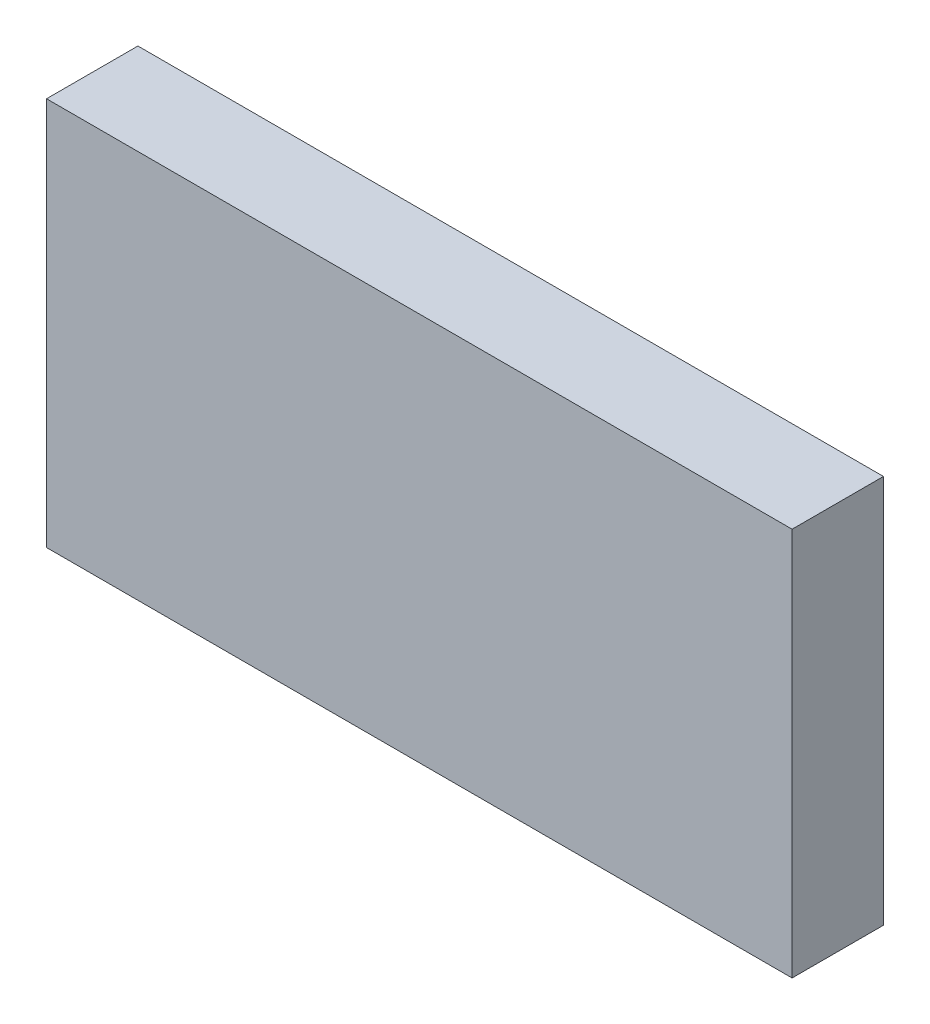
ISO-10303-21;
HEADER;
FILE_DESCRIPTION(('STEP AP214'),'2;1');
FILE_NAME('part.step','',(''),(''),'','','');
FILE_SCHEMA(('AUTOMOTIVE_DESIGN { 1 0 10303 214 1 1 1 1 }'));
ENDSEC;
DATA;
#1=APPLICATION_CONTEXT('core data for automotive mechanical design processes');
#2=APPLICATION_PROTOCOL_DEFINITION('international standard','automotive_design',2000,#1);
#3=PRODUCT_CONTEXT('',#1,'mechanical');
#4=PRODUCT('Part','Part','',(#3));
#5=PRODUCT_RELATED_PRODUCT_CATEGORY('part','',(#4));
#6=PRODUCT_DEFINITION_FORMATION('','',#4);
#7=PRODUCT_DEFINITION_CONTEXT('part definition',#1,'design');
#8=PRODUCT_DEFINITION('design','',#6,#7);
#9=PRODUCT_DEFINITION_SHAPE('','',#8);
#10=(LENGTH_UNIT() NAMED_UNIT(*) SI_UNIT(.MILLI.,.METRE.));
#11=(NAMED_UNIT(*) PLANE_ANGLE_UNIT() SI_UNIT($,.RADIAN.));
#12=(NAMED_UNIT(*) SI_UNIT($,.STERADIAN.) SOLID_ANGLE_UNIT());
#13=UNCERTAINTY_MEASURE_WITH_UNIT(LENGTH_MEASURE(1.E-05),#10,'distance_accuracy_value','');
#14=(GEOMETRIC_REPRESENTATION_CONTEXT(3) GLOBAL_UNCERTAINTY_ASSIGNED_CONTEXT((#13)) GLOBAL_UNIT_ASSIGNED_CONTEXT((#10,
#11,#12)) REPRESENTATION_CONTEXT('',''));
#15=CARTESIAN_POINT('',(0.,0.,0.));
#16=DIRECTION('',(0.,0.,1.));
#17=DIRECTION('',(1.,0.,0.));
#18=AXIS2_PLACEMENT_3D('',#15,#16,#17);
#19=CARTESIAN_POINT('',(0.,0.,0.5));
#20=DIRECTION('',(0.,0.,1.));
#21=DIRECTION('',(1.,0.,0.));
#22=AXIS2_PLACEMENT_3D('',#19,#20,#21);
#23=PLANE('',#22);
#24=DIRECTION('',(1.,0.,0.));
#25=VECTOR('',#24,1.);
#26=CARTESIAN_POINT('',(-2.04,-1.0635,0.5));
#27=LINE('',#26,#25);
#28=CARTESIAN_POINT('',(-2.04,-1.0635,0.5));
#29=VERTEX_POINT('',#28);
#30=CARTESIAN_POINT('',(2.04,-1.0635,0.5));
#31=VERTEX_POINT('',#30);
#32=EDGE_CURVE('E89',#29,#31,#27,.T.);
#33=ORIENTED_EDGE('',*,*,#32,.T.);
#34=DIRECTION('',(0.,1.,0.));
#35=VECTOR('',#34,1.);
#36=CARTESIAN_POINT('',(2.04,-1.0635,0.5));
#37=LINE('',#36,#35);
#38=CARTESIAN_POINT('',(2.04,1.0635,0.5));
#39=VERTEX_POINT('',#38);
#40=EDGE_CURVE('E76',#31,#39,#37,.T.);
#41=ORIENTED_EDGE('',*,*,#40,.T.);
#42=DIRECTION('',(-1.,0.,0.));
#43=VECTOR('',#42,1.);
#44=CARTESIAN_POINT('',(2.04,1.0635,0.5));
#45=LINE('',#44,#43);
#46=CARTESIAN_POINT('',(-2.04,1.0635,0.5));
#47=VERTEX_POINT('',#46);
#48=EDGE_CURVE('E81',#39,#47,#45,.T.);
#49=ORIENTED_EDGE('',*,*,#48,.T.);
#50=DIRECTION('',(0.,-1.,0.));
#51=VECTOR('',#50,1.);
#52=CARTESIAN_POINT('',(-2.04,1.0635,0.5));
#53=LINE('',#52,#51);
#54=EDGE_CURVE('E11',#47,#29,#53,.T.);
#55=ORIENTED_EDGE('',*,*,#54,.T.);
#56=EDGE_LOOP('',(#33,#41,#49,#55));
#57=FACE_BOUND('',#56,.T.);
#58=ADVANCED_FACE('F16',(#57),#23,.T.);
#59=CARTESIAN_POINT('',(0.,0.,0.));
#60=DIRECTION('',(0.,0.,1.));
#61=DIRECTION('',(1.,0.,0.));
#62=AXIS2_PLACEMENT_3D('',#59,#60,#61);
#63=PLANE('',#62);
#64=DIRECTION('',(1.,0.,0.));
#65=VECTOR('',#64,1.);
#66=CARTESIAN_POINT('',(-2.04,-1.0635,0.));
#67=LINE('',#66,#65);
#68=CARTESIAN_POINT('',(-2.04,-1.0635,0.));
#69=VERTEX_POINT('',#68);
#70=CARTESIAN_POINT('',(2.04,-1.0635,0.));
#71=VERTEX_POINT('',#70);
#72=EDGE_CURVE('E100',#69,#71,#67,.T.);
#73=ORIENTED_EDGE('',*,*,#72,.F.);
#74=DIRECTION('',(0.,-1.,0.));
#75=VECTOR('',#74,1.);
#76=CARTESIAN_POINT('',(-2.04,1.0635,0.));
#77=LINE('',#76,#75);
#78=CARTESIAN_POINT('',(-2.04,1.0635,0.));
#79=VERTEX_POINT('',#78);
#80=EDGE_CURVE('E26',#79,#69,#77,.T.);
#81=ORIENTED_EDGE('',*,*,#80,.F.);
#82=DIRECTION('',(-1.,0.,0.));
#83=VECTOR('',#82,1.);
#84=CARTESIAN_POINT('',(2.04,1.0635,0.));
#85=LINE('',#84,#83);
#86=CARTESIAN_POINT('',(2.04,1.0635,0.));
#87=VERTEX_POINT('',#86);
#88=EDGE_CURVE('E65',#87,#79,#85,.T.);
#89=ORIENTED_EDGE('',*,*,#88,.F.);
#90=DIRECTION('',(0.,1.,0.));
#91=VECTOR('',#90,1.);
#92=CARTESIAN_POINT('',(2.04,-1.0635,0.));
#93=LINE('',#92,#91);
#94=EDGE_CURVE('E70',#71,#87,#93,.T.);
#95=ORIENTED_EDGE('',*,*,#94,.F.);
#96=EDGE_LOOP('',(#73,#81,#89,#95));
#97=FACE_BOUND('',#96,.T.);
#98=ADVANCED_FACE('F68',(#97),#63,.F.);
#99=CARTESIAN_POINT('',(-2.04,1.0635,0.));
#100=DIRECTION('',(1.,0.,0.));
#101=DIRECTION('',(0.,1.,0.));
#102=AXIS2_PLACEMENT_3D('',#99,#100,#101);
#103=PLANE('',#102);
#104=DIRECTION('',(0.,0.,1.));
#105=VECTOR('',#104,1.);
#106=CARTESIAN_POINT('',(-2.04,1.0635,0.));
#107=LINE('',#106,#105);
#108=EDGE_CURVE('E75',#79,#47,#107,.T.);
#109=ORIENTED_EDGE('',*,*,#108,.F.);
#110=ORIENTED_EDGE('',*,*,#80,.T.);
#111=DIRECTION('',(0.,0.,1.));
#112=VECTOR('',#111,1.);
#113=CARTESIAN_POINT('',(-2.04,-1.0635,0.));
#114=LINE('',#113,#112);
#115=EDGE_CURVE('E97',#69,#29,#114,.T.);
#116=ORIENTED_EDGE('',*,*,#115,.T.);
#117=ORIENTED_EDGE('',*,*,#54,.F.);
#118=EDGE_LOOP('',(#109,#110,#116,#117));
#119=FACE_BOUND('',#118,.T.);
#120=ADVANCED_FACE('F120',(#119),#103,.F.);
#121=CARTESIAN_POINT('',(2.04,1.0635,0.));
#122=DIRECTION('',(0.,-1.,0.));
#123=DIRECTION('',(0.,0.,-1.));
#124=AXIS2_PLACEMENT_3D('',#121,#122,#123);
#125=PLANE('',#124);
#126=DIRECTION('',(0.,0.,1.));
#127=VECTOR('',#126,1.);
#128=CARTESIAN_POINT('',(2.04,1.0635,0.));
#129=LINE('',#128,#127);
#130=EDGE_CURVE('E79',#87,#39,#129,.T.);
#131=ORIENTED_EDGE('',*,*,#130,.F.);
#132=ORIENTED_EDGE('',*,*,#88,.T.);
#133=ORIENTED_EDGE('',*,*,#108,.T.);
#134=ORIENTED_EDGE('',*,*,#48,.F.);
#135=EDGE_LOOP('',(#131,#132,#133,#134));
#136=FACE_BOUND('',#135,.T.);
#137=ADVANCED_FACE('F80',(#136),#125,.F.);
#138=CARTESIAN_POINT('',(2.04,-1.0635,0.));
#139=DIRECTION('',(-1.,0.,0.));
#140=DIRECTION('',(0.,0.,1.));
#141=AXIS2_PLACEMENT_3D('',#138,#139,#140);
#142=PLANE('',#141);
#143=DIRECTION('',(0.,0.,1.));
#144=VECTOR('',#143,1.);
#145=CARTESIAN_POINT('',(2.04,-1.0635,0.));
#146=LINE('',#145,#144);
#147=EDGE_CURVE('E19',#71,#31,#146,.T.);
#148=ORIENTED_EDGE('',*,*,#147,.F.);
#149=ORIENTED_EDGE('',*,*,#94,.T.);
#150=ORIENTED_EDGE('',*,*,#130,.T.);
#151=ORIENTED_EDGE('',*,*,#40,.F.);
#152=EDGE_LOOP('',(#148,#149,#150,#151));
#153=FACE_BOUND('',#152,.T.);
#154=ADVANCED_FACE('F85',(#153),#142,.F.);
#155=CARTESIAN_POINT('',(-2.04,-1.0635,0.));
#156=DIRECTION('',(0.,1.,0.));
#157=DIRECTION('',(1.,0.,0.));
#158=AXIS2_PLACEMENT_3D('',#155,#156,#157);
#159=PLANE('',#158);
#160=ORIENTED_EDGE('',*,*,#115,.F.);
#161=ORIENTED_EDGE('',*,*,#72,.T.);
#162=ORIENTED_EDGE('',*,*,#147,.T.);
#163=ORIENTED_EDGE('',*,*,#32,.F.);
#164=EDGE_LOOP('',(#160,#161,#162,#163));
#165=FACE_BOUND('',#164,.T.);
#166=ADVANCED_FACE('F107',(#165),#159,.F.);
#167=CLOSED_SHELL('',(#58,#98,#120,#137,#154,#166));
#168=MANIFOLD_SOLID_BREP('B1',#167);
#169=ADVANCED_BREP_SHAPE_REPRESENTATION('',(#18,#168),#14);
#170=SHAPE_DEFINITION_REPRESENTATION(#9,#169);
ENDSEC;
END-ISO-10303-21;
